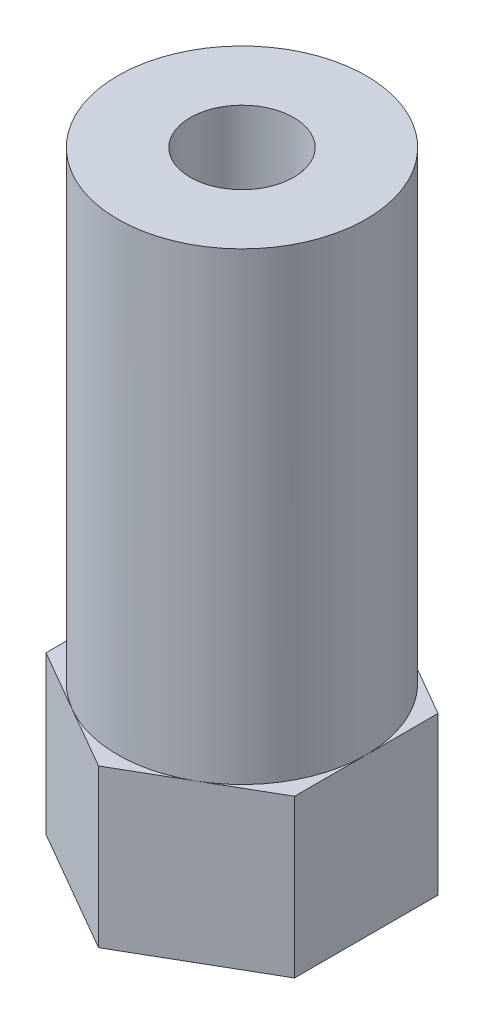
ISO-10303-21;
HEADER;
FILE_DESCRIPTION(('STEP AP214'),'2;1');
FILE_NAME('part.step','',(''),(''),'','','');
FILE_SCHEMA(('AUTOMOTIVE_DESIGN { 1 0 10303 214 1 1 1 1 }'));
ENDSEC;
DATA;
#1=APPLICATION_CONTEXT('core data for automotive mechanical design processes');
#2=APPLICATION_PROTOCOL_DEFINITION('international standard','automotive_design',2000,#1);
#3=PRODUCT_CONTEXT('',#1,'mechanical');
#4=PRODUCT('Part','Part','',(#3));
#5=PRODUCT_RELATED_PRODUCT_CATEGORY('part','',(#4));
#6=PRODUCT_DEFINITION_FORMATION('','',#4);
#7=PRODUCT_DEFINITION_CONTEXT('part definition',#1,'design');
#8=PRODUCT_DEFINITION('design','',#6,#7);
#9=PRODUCT_DEFINITION_SHAPE('','',#8);
#10=(LENGTH_UNIT() NAMED_UNIT(*) SI_UNIT(.MILLI.,.METRE.));
#11=(NAMED_UNIT(*) PLANE_ANGLE_UNIT() SI_UNIT($,.RADIAN.));
#12=(NAMED_UNIT(*) SI_UNIT($,.STERADIAN.) SOLID_ANGLE_UNIT());
#13=UNCERTAINTY_MEASURE_WITH_UNIT(LENGTH_MEASURE(1.E-05),#10,'distance_accuracy_value','');
#14=(GEOMETRIC_REPRESENTATION_CONTEXT(3) GLOBAL_UNCERTAINTY_ASSIGNED_CONTEXT((#13)) GLOBAL_UNIT_ASSIGNED_CONTEXT((#10,
#11,#12)) REPRESENTATION_CONTEXT('',''));
#15=CARTESIAN_POINT('',(0.,0.,0.));
#16=DIRECTION('',(0.,0.,1.));
#17=DIRECTION('',(1.,0.,0.));
#18=AXIS2_PLACEMENT_3D('',#15,#16,#17);
#19=CARTESIAN_POINT('',(0.,7.6,0.));
#20=DIRECTION('',(0.,1.,0.));
#21=DIRECTION('',(0.,0.,1.));
#22=AXIS2_PLACEMENT_3D('',#19,#20,#21);
#23=PLANE('',#22);
#24=CARTESIAN_POINT('',(0.,7.6,0.));
#25=DIRECTION('',(0.,1.,0.));
#26=DIRECTION('',(0.,0.,1.));
#27=AXIS2_PLACEMENT_3D('',#24,#25,#26);
#28=CIRCLE('',#27,5.99999999999998);
#29=CARTESIAN_POINT('',(2.99999999999996,7.6,5.19615242270663));
#30=VERTEX_POINT('',#29);
#31=CARTESIAN_POINT('',(6.00000000000002,7.6,0.));
#32=VERTEX_POINT('',#31);
#33=EDGE_CURVE('E49',#30,#32,#28,.T.);
#34=ORIENTED_EDGE('',*,*,#33,.F.);
#35=DIRECTION('',(0.866025403784441,0.,-0.499999999999996));
#36=VECTOR('',#35,1.);
#37=CARTESIAN_POINT('',(0.,7.6,6.92820323027551));
#38=LINE('',#37,#36);
#39=CARTESIAN_POINT('',(6.00000000000001,7.6,3.46410161513774));
#40=VERTEX_POINT('',#39);
#41=EDGE_CURVE('E124',#30,#40,#38,.T.);
#42=ORIENTED_EDGE('',*,*,#41,.T.);
#43=DIRECTION('',(0.,0.,-1.));
#44=VECTOR('',#43,1.);
#45=CARTESIAN_POINT('',(6.00000000000001,7.6,3.46410161513774));
#46=LINE('',#45,#44);
#47=EDGE_CURVE('E136',#40,#32,#46,.T.);
#48=ORIENTED_EDGE('',*,*,#47,.T.);
#49=EDGE_LOOP('',(#34,#42,#48));
#50=FACE_BOUND('',#49,.T.);
#51=ADVANCED_FACE('F33',(#50),#23,.T.);
#52=CARTESIAN_POINT('',(3.00000000000006,7.6,-5.1961524227066));
#53=VERTEX_POINT('',#52);
#54=EDGE_CURVE('E11',#32,#53,#28,.T.);
#55=ORIENTED_EDGE('',*,*,#54,.F.);
#56=CARTESIAN_POINT('',(6.00000000000004,7.6,-3.46410161513769));
#57=VERTEX_POINT('',#56);
#58=EDGE_CURVE('E123',#32,#57,#46,.T.);
#59=ORIENTED_EDGE('',*,*,#58,.T.);
#60=DIRECTION('',(-0.866025403784433,0.,-0.500000000000009));
#61=VECTOR('',#60,1.);
#62=CARTESIAN_POINT('',(6.00000000000004,7.6,-3.46410161513769));
#63=LINE('',#62,#61);
#64=EDGE_CURVE('E148',#57,#53,#63,.T.);
#65=ORIENTED_EDGE('',*,*,#64,.T.);
#66=EDGE_LOOP('',(#55,#59,#65));
#67=FACE_BOUND('',#66,.T.);
#68=ADVANCED_FACE('F207',(#67),#23,.T.);
#69=CARTESIAN_POINT('',(-2.99999999999994,7.6,-5.19615242270667));
#70=VERTEX_POINT('',#69);
#71=EDGE_CURVE('E47',#53,#70,#28,.T.);
#72=ORIENTED_EDGE('',*,*,#71,.F.);
#73=CARTESIAN_POINT('',(0.,7.6,-6.92820323027551));
#74=VERTEX_POINT('',#73);
#75=EDGE_CURVE('E147',#53,#74,#63,.T.);
#76=ORIENTED_EDGE('',*,*,#75,.T.);
#77=DIRECTION('',(-0.866025403784444,0.,0.499999999999991));
#78=VECTOR('',#77,1.);
#79=CARTESIAN_POINT('',(0.,7.6,-6.92820323027551));
#80=LINE('',#79,#78);
#81=EDGE_CURVE('E152',#74,#70,#80,.T.);
#82=ORIENTED_EDGE('',*,*,#81,.T.);
#83=EDGE_LOOP('',(#72,#76,#82));
#84=FACE_BOUND('',#83,.T.);
#85=ADVANCED_FACE('F205',(#84),#23,.T.);
#86=CARTESIAN_POINT('',(-6.,7.6,0.));
#87=VERTEX_POINT('',#86);
#88=EDGE_CURVE('E64',#70,#87,#28,.T.);
#89=ORIENTED_EDGE('',*,*,#88,.F.);
#90=CARTESIAN_POINT('',(-5.99999999999996,7.6,-3.46410161513782));
#91=VERTEX_POINT('',#90);
#92=EDGE_CURVE('E151',#70,#91,#80,.T.);
#93=ORIENTED_EDGE('',*,*,#92,.T.);
#94=DIRECTION('',(0.,0.,1.));
#95=VECTOR('',#94,1.);
#96=CARTESIAN_POINT('',(-5.99999999999996,7.6,-3.46410161513782));
#97=LINE('',#96,#95);
#98=EDGE_CURVE('E156',#91,#87,#97,.T.);
#99=ORIENTED_EDGE('',*,*,#98,.T.);
#100=EDGE_LOOP('',(#89,#93,#99));
#101=FACE_BOUND('',#100,.T.);
#102=ADVANCED_FACE('F214',(#101),#23,.T.);
#103=CARTESIAN_POINT('',(-3.00000000000006,7.6,5.1961524227066));
#104=VERTEX_POINT('',#103);
#105=EDGE_CURVE('E56',#87,#104,#28,.T.);
#106=ORIENTED_EDGE('',*,*,#105,.F.);
#107=CARTESIAN_POINT('',(-6.00000000000004,7.6,3.46410161513769));
#108=VERTEX_POINT('',#107);
#109=EDGE_CURVE('E155',#87,#108,#97,.T.);
#110=ORIENTED_EDGE('',*,*,#109,.T.);
#111=DIRECTION('',(0.866025403784433,0.,0.500000000000009));
#112=VECTOR('',#111,1.);
#113=CARTESIAN_POINT('',(-6.00000000000004,7.6,3.46410161513769));
#114=LINE('',#113,#112);
#115=EDGE_CURVE('E134',#108,#104,#114,.T.);
#116=ORIENTED_EDGE('',*,*,#115,.T.);
#117=EDGE_LOOP('',(#106,#110,#116));
#118=FACE_BOUND('',#117,.T.);
#119=ADVANCED_FACE('F219',(#118),#23,.T.);
#120=CARTESIAN_POINT('',(-6.00000000000004,7.6,3.46410161513769));
#121=DIRECTION('',(0.500000000000009,0.,-0.866025403784433));
#122=DIRECTION('',(-0.866025403784433,0.,-0.500000000000009));
#123=AXIS2_PLACEMENT_3D('',#120,#121,#122);
#124=PLANE('',#123);
#125=DIRECTION('',(0.866025403784433,0.,0.500000000000009));
#126=VECTOR('',#125,1.);
#127=CARTESIAN_POINT('',(-6.00000000000004,0.,3.46410161513769));
#128=LINE('',#127,#126);
#129=CARTESIAN_POINT('',(-6.00000000000004,0.,3.46410161513769));
#130=VERTEX_POINT('',#129);
#131=CARTESIAN_POINT('',(0.,0.,6.92820323027551));
#132=VERTEX_POINT('',#131);
#133=EDGE_CURVE('E159',#130,#132,#128,.T.);
#134=ORIENTED_EDGE('',*,*,#133,.T.);
#135=DIRECTION('',(0.,-1.,0.));
#136=VECTOR('',#135,1.);
#137=CARTESIAN_POINT('',(0.,7.6,6.92820323027551));
#138=LINE('',#137,#136);
#139=CARTESIAN_POINT('',(0.,7.6,6.92820323027551));
#140=VERTEX_POINT('',#139);
#141=EDGE_CURVE('E141',#140,#132,#138,.T.);
#142=ORIENTED_EDGE('',*,*,#141,.F.);
#143=EDGE_CURVE('E119',#104,#140,#114,.T.);
#144=ORIENTED_EDGE('',*,*,#143,.F.);
#145=ORIENTED_EDGE('',*,*,#115,.F.);
#146=DIRECTION('',(0.,-1.,0.));
#147=VECTOR('',#146,1.);
#148=CARTESIAN_POINT('',(-6.00000000000004,7.6,3.46410161513769));
#149=LINE('',#148,#147);
#150=EDGE_CURVE('E158',#108,#130,#149,.T.);
#151=ORIENTED_EDGE('',*,*,#150,.T.);
#152=EDGE_LOOP('',(#134,#142,#144,#145,#151));
#153=FACE_BOUND('',#152,.T.);
#154=ADVANCED_FACE('F35',(#153),#124,.F.);
#155=CARTESIAN_POINT('',(0.,7.6,6.92820323027551));
#156=DIRECTION('',(-0.499999999999996,0.,-0.866025403784441));
#157=DIRECTION('',(-0.866025403784441,0.,0.499999999999996));
#158=AXIS2_PLACEMENT_3D('',#155,#156,#157);
#159=PLANE('',#158);
#160=DIRECTION('',(0.866025403784441,0.,-0.499999999999996));
#161=VECTOR('',#160,1.);
#162=CARTESIAN_POINT('',(0.,0.,6.92820323027551));
#163=LINE('',#162,#161);
#164=CARTESIAN_POINT('',(6.00000000000001,0.,3.46410161513774));
#165=VERTEX_POINT('',#164);
#166=EDGE_CURVE('E162',#132,#165,#163,.T.);
#167=ORIENTED_EDGE('',*,*,#166,.T.);
#168=DIRECTION('',(0.,-1.,0.));
#169=VECTOR('',#168,1.);
#170=CARTESIAN_POINT('',(6.00000000000001,7.6,3.46410161513774));
#171=LINE('',#170,#169);
#172=EDGE_CURVE('E130',#40,#165,#171,.T.);
#173=ORIENTED_EDGE('',*,*,#172,.F.);
#174=ORIENTED_EDGE('',*,*,#41,.F.);
#175=EDGE_CURVE('E113',#140,#30,#38,.T.);
#176=ORIENTED_EDGE('',*,*,#175,.F.);
#177=ORIENTED_EDGE('',*,*,#141,.T.);
#178=EDGE_LOOP('',(#167,#173,#174,#176,#177));
#179=FACE_BOUND('',#178,.T.);
#180=ADVANCED_FACE('F128',(#179),#159,.F.);
#181=CARTESIAN_POINT('',(6.00000000000001,7.6,3.46410161513774));
#182=DIRECTION('',(-1.,0.,0.));
#183=DIRECTION('',(0.,0.,1.));
#184=AXIS2_PLACEMENT_3D('',#181,#182,#183);
#185=PLANE('',#184);
#186=DIRECTION('',(0.,0.,-1.));
#187=VECTOR('',#186,1.);
#188=CARTESIAN_POINT('',(6.00000000000001,0.,3.46410161513774));
#189=LINE('',#188,#187);
#190=CARTESIAN_POINT('',(6.00000000000004,0.,-3.46410161513769));
#191=VERTEX_POINT('',#190);
#192=EDGE_CURVE('E164',#165,#191,#189,.T.);
#193=ORIENTED_EDGE('',*,*,#192,.T.);
#194=DIRECTION('',(0.,-1.,0.));
#195=VECTOR('',#194,1.);
#196=CARTESIAN_POINT('',(6.00000000000004,7.6,-3.46410161513769));
#197=LINE('',#196,#195);
#198=EDGE_CURVE('E180',#57,#191,#197,.T.);
#199=ORIENTED_EDGE('',*,*,#198,.F.);
#200=ORIENTED_EDGE('',*,*,#58,.F.);
#201=ORIENTED_EDGE('',*,*,#47,.F.);
#202=ORIENTED_EDGE('',*,*,#172,.T.);
#203=EDGE_LOOP('',(#193,#199,#200,#201,#202));
#204=FACE_BOUND('',#203,.T.);
#205=ADVANCED_FACE('F185',(#204),#185,.F.);
#206=CARTESIAN_POINT('',(6.00000000000004,7.6,-3.46410161513769));
#207=DIRECTION('',(-0.500000000000009,0.,0.866025403784433));
#208=DIRECTION('',(0.866025403784433,0.,0.500000000000009));
#209=AXIS2_PLACEMENT_3D('',#206,#207,#208);
#210=PLANE('',#209);
#211=DIRECTION('',(-0.866025403784433,0.,-0.500000000000009));
#212=VECTOR('',#211,1.);
#213=CARTESIAN_POINT('',(6.00000000000004,0.,-3.46410161513769));
#214=LINE('',#213,#212);
#215=CARTESIAN_POINT('',(0.,0.,-6.92820323027551));
#216=VERTEX_POINT('',#215);
#217=EDGE_CURVE('E166',#191,#216,#214,.T.);
#218=ORIENTED_EDGE('',*,*,#217,.T.);
#219=DIRECTION('',(0.,-1.,0.));
#220=VECTOR('',#219,1.);
#221=CARTESIAN_POINT('',(0.,7.6,-6.92820323027551));
#222=LINE('',#221,#220);
#223=EDGE_CURVE('E177',#74,#216,#222,.T.);
#224=ORIENTED_EDGE('',*,*,#223,.F.);
#225=ORIENTED_EDGE('',*,*,#75,.F.);
#226=ORIENTED_EDGE('',*,*,#64,.F.);
#227=ORIENTED_EDGE('',*,*,#198,.T.);
#228=EDGE_LOOP('',(#218,#224,#225,#226,#227));
#229=FACE_BOUND('',#228,.T.);
#230=ADVANCED_FACE('F196',(#229),#210,.F.);
#231=CARTESIAN_POINT('',(0.,7.6,-6.92820323027551));
#232=DIRECTION('',(0.499999999999991,0.,0.866025403784444));
#233=DIRECTION('',(0.866025403784444,0.,-0.499999999999991));
#234=AXIS2_PLACEMENT_3D('',#231,#232,#233);
#235=PLANE('',#234);
#236=DIRECTION('',(-0.866025403784444,0.,0.499999999999991));
#237=VECTOR('',#236,1.);
#238=CARTESIAN_POINT('',(0.,0.,-6.92820323027551));
#239=LINE('',#238,#237);
#240=CARTESIAN_POINT('',(-5.99999999999996,0.,-3.46410161513782));
#241=VERTEX_POINT('',#240);
#242=EDGE_CURVE('E168',#216,#241,#239,.T.);
#243=ORIENTED_EDGE('',*,*,#242,.T.);
#244=DIRECTION('',(0.,-1.,0.));
#245=VECTOR('',#244,1.);
#246=CARTESIAN_POINT('',(-5.99999999999996,7.6,-3.46410161513782));
#247=LINE('',#246,#245);
#248=EDGE_CURVE('E174',#91,#241,#247,.T.);
#249=ORIENTED_EDGE('',*,*,#248,.F.);
#250=ORIENTED_EDGE('',*,*,#92,.F.);
#251=ORIENTED_EDGE('',*,*,#81,.F.);
#252=ORIENTED_EDGE('',*,*,#223,.T.);
#253=EDGE_LOOP('',(#243,#249,#250,#251,#252));
#254=FACE_BOUND('',#253,.T.);
#255=ADVANCED_FACE('F201',(#254),#235,.F.);
#256=CARTESIAN_POINT('',(-5.99999999999996,7.6,-3.46410161513782));
#257=DIRECTION('',(1.,0.,0.));
#258=DIRECTION('',(0.,0.,-1.));
#259=AXIS2_PLACEMENT_3D('',#256,#257,#258);
#260=PLANE('',#259);
#261=DIRECTION('',(0.,0.,1.));
#262=VECTOR('',#261,1.);
#263=CARTESIAN_POINT('',(-5.99999999999996,0.,-3.46410161513782));
#264=LINE('',#263,#262);
#265=EDGE_CURVE('E170',#241,#130,#264,.T.);
#266=ORIENTED_EDGE('',*,*,#265,.T.);
#267=ORIENTED_EDGE('',*,*,#150,.F.);
#268=ORIENTED_EDGE('',*,*,#109,.F.);
#269=ORIENTED_EDGE('',*,*,#98,.F.);
#270=ORIENTED_EDGE('',*,*,#248,.T.);
#271=EDGE_LOOP('',(#266,#267,#268,#269,#270));
#272=FACE_BOUND('',#271,.T.);
#273=ADVANCED_FACE('F218',(#272),#260,.F.);
#274=EDGE_CURVE('E117',#104,#30,#28,.T.);
#275=ORIENTED_EDGE('',*,*,#274,.F.);
#276=ORIENTED_EDGE('',*,*,#143,.T.);
#277=ORIENTED_EDGE('',*,*,#175,.T.);
#278=EDGE_LOOP('',(#275,#276,#277));
#279=FACE_BOUND('',#278,.T.);
#280=ADVANCED_FACE('F115',(#279),#23,.T.);
#281=CARTESIAN_POINT('',(0.,0.,0.));
#282=DIRECTION('',(0.,1.,0.));
#283=DIRECTION('',(0.,0.,1.));
#284=AXIS2_PLACEMENT_3D('',#281,#282,#283);
#285=PLANE('',#284);
#286=CARTESIAN_POINT('',(0.,0.,0.));
#287=DIRECTION('',(0.,1.,0.));
#288=DIRECTION('',(0.,0.,1.));
#289=AXIS2_PLACEMENT_3D('',#286,#287,#288);
#290=CIRCLE('',#289,2.5);
#291=CARTESIAN_POINT('',(0.,0.,2.5));
#292=VERTEX_POINT('',#291);
#293=EDGE_CURVE('E139',#292,#292,#290,.T.);
#294=ORIENTED_EDGE('',*,*,#293,.T.);
#295=EDGE_LOOP('',(#294));
#296=FACE_BOUND('',#295,.T.);
#297=ORIENTED_EDGE('',*,*,#133,.F.);
#298=ORIENTED_EDGE('',*,*,#265,.F.);
#299=ORIENTED_EDGE('',*,*,#242,.F.);
#300=ORIENTED_EDGE('',*,*,#217,.F.);
#301=ORIENTED_EDGE('',*,*,#192,.F.);
#302=ORIENTED_EDGE('',*,*,#166,.F.);
#303=EDGE_LOOP('',(#297,#298,#299,#300,#301,#302));
#304=FACE_BOUND('',#303,.T.);
#305=ADVANCED_FACE('F191',(#296,#304),#285,.F.);
#306=CARTESIAN_POINT('',(0.,30.,0.));
#307=DIRECTION('',(0.,-1.,0.));
#308=DIRECTION('',(0.,0.,-1.));
#309=AXIS2_PLACEMENT_3D('',#306,#307,#308);
#310=CYLINDRICAL_SURFACE('',#309,5.99999999999998);
#311=CARTESIAN_POINT('',(2.09201448776538,27.46,-5.62347538297977));
#312=CARTESIAN_POINT('',(2.09201693146201,27.4042497007416,-5.6234751343233));
#313=CARTESIAN_POINT('',(2.09646398959437,27.3484689575901,-5.6218262814458));
#314=CARTESIAN_POINT('',(2.11409376047993,27.2384725827119,-5.61521974757585));
#315=CARTESIAN_POINT('',(2.12728452929234,27.1842584425002,-5.61025901513725));
#316=CARTESIAN_POINT('',(2.16189361441686,27.0790030866573,-5.59701321566238));
#317=CARTESIAN_POINT('',(2.18330505447361,27.0279592605335,-5.58873092671505));
#318=CARTESIAN_POINT('',(2.233582346594,26.9304076181145,-5.56882730470198));
#319=CARTESIAN_POINT('',(2.2624473597739,26.8838992921695,-5.55720634737967));
#320=CARTESIAN_POINT('',(2.32693292822022,26.7962748601017,-5.53051607905543));
#321=CARTESIAN_POINT('',(2.36261083806936,26.7552099474454,-5.51541724919479));
#322=CARTESIAN_POINT('',(2.43937429545879,26.6800826772554,-5.48189782216839));
#323=CARTESIAN_POINT('',(2.48046016326602,26.6460207347539,-5.46347702824728));
#324=CARTESIAN_POINT('',(2.56698353929338,26.5856741731123,-5.42336420820773));
#325=CARTESIAN_POINT('',(2.61244556167514,26.5594371969073,-5.40165330999448));
#326=CARTESIAN_POINT('',(2.70606794166505,26.5157915717878,-5.35536366107626));
#327=CARTESIAN_POINT('',(2.75422812359837,26.4983823488461,-5.33078509696998));
#328=CARTESIAN_POINT('',(2.85129295237778,26.4730429860064,-5.27949924185673));
#329=CARTESIAN_POINT('',(2.90018662424429,26.4650268335981,-5.25281369396614));
#330=CARTESIAN_POINT('',(2.99767920788383,26.458433698339,-5.1977929212682));
#331=CARTESIAN_POINT('',(3.04627813946715,26.4598560739011,-5.16945780872032));
#332=CARTESIAN_POINT('',(3.14130776814618,26.4720325406113,-5.11226290857682));
#333=CARTESIAN_POINT('',(3.18775517312189,26.4826940653637,-5.08341109737747));
#334=CARTESIAN_POINT('',(3.2777576532119,26.5129004296986,-5.02584920657126));
#335=CARTESIAN_POINT('',(3.32131264018966,26.5324455398358,-4.99713913130796));
#336=CARTESIAN_POINT('',(3.4046489132438,26.5799562561261,-4.94073998144625));
#337=CARTESIAN_POINT('',(3.44441200889309,26.607960004833,-4.91305618318792));
#338=CARTESIAN_POINT('',(3.51903146572504,26.671565129054,-4.85988886819197));
#339=CARTESIAN_POINT('',(3.55388742940056,26.7071671194843,-4.83440552976936));
#340=CARTESIAN_POINT('',(3.61833579425722,26.7854715226477,-4.78636441574121));
#341=CARTESIAN_POINT('',(3.64785920726528,26.8282548379604,-4.76384588403876));
#342=CARTESIAN_POINT('',(3.70049280901762,26.9194348360863,-4.72307788750329));
#343=CARTESIAN_POINT('',(3.72360293860442,26.9678315706731,-4.70482846204965));
#344=CARTESIAN_POINT('',(3.76294760600346,27.068956656751,-4.67342089222699));
#345=CARTESIAN_POINT('',(3.77917441368343,27.1216897992368,-4.66026847334058));
#346=CARTESIAN_POINT('',(3.8043642885429,27.229939628923,-4.63972834160438));
#347=CARTESIAN_POINT('',(3.8133279953001,27.285456070573,-4.63234012117012));
#348=CARTESIAN_POINT('',(3.82373331669719,27.3969864624649,-4.62375487120993));
#349=CARTESIAN_POINT('',(3.82526349106369,27.4529865518808,-4.6224849525306));
#350=CARTESIAN_POINT('',(3.82100851820623,27.5645146686763,-4.62600272754065));
#351=CARTESIAN_POINT('',(3.81522365353291,27.6200427142056,-4.63079018725778));
#352=CARTESIAN_POINT('',(3.79652481383217,27.7286911036763,-4.64613200181076));
#353=CARTESIAN_POINT('',(3.78365616631076,27.7818244559512,-4.65664968590434));
#354=CARTESIAN_POINT('',(3.75109084234002,27.8845880665118,-4.68292137058537));
#355=CARTESIAN_POINT('',(3.73139375742191,27.9342181150204,-4.69867568441929));
#356=CARTESIAN_POINT('',(3.68536138576027,28.0290698377624,-4.7348678258058));
#357=CARTESIAN_POINT('',(3.65896654715865,28.0742466291024,-4.7553475115461));
#358=CARTESIAN_POINT('',(3.60017336002657,28.158445413078,-4.80001160305553));
#359=CARTESIAN_POINT('',(3.56777458922525,28.1974669724439,-4.82419626938402));
#360=CARTESIAN_POINT('',(3.49728894070413,28.2686607570915,-4.87553967778519));
#361=CARTESIAN_POINT('',(3.45914641209303,28.3007575305138,-4.90272673385571));
#362=CARTESIAN_POINT('',(3.37829509287796,28.356662130802,-4.95878398546573));
#363=CARTESIAN_POINT('',(3.33558645003686,28.3804702257895,-4.98765412652559));
#364=CARTESIAN_POINT('',(3.246848447431,28.4190042335819,-5.0458672342255));
#365=CARTESIAN_POINT('',(3.20083451867359,28.433769630294,-5.07520756288079));
#366=CARTESIAN_POINT('',(3.10654255311907,28.4539262395855,-5.13346494997755));
#367=CARTESIAN_POINT('',(3.05826470295337,28.4593182234929,-5.16238204305242));
#368=CARTESIAN_POINT('',(2.96140704441945,28.4605527529249,-5.21854048344576));
#369=CARTESIAN_POINT('',(2.91283796503161,28.4565101015764,-5.24579787813237));
#370=CARTESIAN_POINT('',(2.81624166887481,28.4392384310922,-5.29828323633543));
#371=CARTESIAN_POINT('',(2.76821444907319,28.4260094633962,-5.32351121121493));
#372=CARTESIAN_POINT('',(2.67419365552177,28.3907847337825,-5.37135643737686));
#373=CARTESIAN_POINT('',(2.62819788066151,28.3687987327158,-5.39397655937374));
#374=CARTESIAN_POINT('',(2.53957830555703,28.3166968255079,-5.43626301740996));
#375=CARTESIAN_POINT('',(2.49695466528221,28.2865805339756,-5.45592921335884));
#376=CARTESIAN_POINT('',(2.41593408374924,28.2186659630152,-5.49229093721271));
#377=CARTESIAN_POINT('',(2.37759116722539,28.1807836180972,-5.5089498457458));
#378=CARTESIAN_POINT('',(2.30693991878812,28.0985886768407,-5.53890825010822));
#379=CARTESIAN_POINT('',(2.27463300243959,28.0542745764434,-5.55220695815921));
#380=CARTESIAN_POINT('',(2.21695489814451,27.9601018709969,-5.57548993841061));
#381=CARTESIAN_POINT('',(2.19163438661865,27.9102062640648,-5.58545010051414));
#382=CARTESIAN_POINT('',(2.1491719924284,27.8065563056354,-5.6019267142427));
#383=CARTESIAN_POINT('',(2.13202193973664,27.7528058709212,-5.60844660666065));
#384=CARTESIAN_POINT('',(2.11024274857755,27.6590384922093,-5.61666849933777));
#385=CARTESIAN_POINT('',(2.10342050654989,27.6195892768166,-5.61922112116285));
#386=CARTESIAN_POINT('',(2.09430553934738,27.5400986060636,-5.6226246368685));
#387=CARTESIAN_POINT('',(2.09201273194431,27.5000571614679,-5.623475561642));
#388=CARTESIAN_POINT('',(2.09201448776538,27.46,-5.62347538297977));
#389=B_SPLINE_CURVE_WITH_KNOTS('',3,(#311,#312,#313,#314,#315,#316,#317,#318,#319,#320,#321,
#322,#323,#324,#325,#326,#327,#328,#329,#330,#331,#332,#333,#334,#335,#336,#337,#338,#339,#340,
#341,#342,#343,#344,#345,#346,#347,#348,#349,#350,#351,#352,#353,#354,#355,#356,#357,#358,#359,
#360,#361,#362,#363,#364,#365,#366,#367,#368,#369,#370,#371,#372,#373,#374,#375,#376,#377,#378,
#379,#380,#381,#382,#383,#384,#385,#386,#387,#388),.UNSPECIFIED.,.T.,.F.,(4,2,2,2,2,2,2,2,2,2,2,
2,2,2,2,2,2,2,2,2,2,2,2,2,2,2,2,2,2,2,2,2,2,2,2,2,2,2,4),(0.,0.167104415562128,
0.334363007967779,0.501481999132666,0.668582189603683,0.837156636605447,1.00574107132038,
1.17533192042833,1.34491174042704,1.51292626987285,1.68092937859336,1.84726848464127,
2.01361265698073,2.1807184165403,2.34783770488965,2.51698449383109,2.68613284296667,
2.85547064997701,3.02479354373491,3.19209416966424,3.3593883336385,3.52562425852456,
3.69187012915689,3.8596493710334,4.02744041770535,4.19697645212412,4.36650700188939,
4.53529193765318,4.704062983632,4.87079110504626,5.03751829285789,5.20406015931243,
5.37060992155194,5.53906798983561,5.70756551550984,5.87725491045141,6.04677426695052,
6.16684268214776,6.28690891757998),.UNSPECIFIED.);
#390=CARTESIAN_POINT('',(2.09201448776538,27.46,-5.62347538297977));
#391=VERTEX_POINT('',#390);
#392=EDGE_CURVE('E343',#391,#391,#389,.T.);
#393=ORIENTED_EDGE('',*,*,#392,.T.);
#394=EDGE_LOOP('',(#393));
#395=FACE_BOUND('',#394,.T.);
#396=CARTESIAN_POINT('',(0.,30.,0.));
#397=DIRECTION('',(0.,1.,0.));
#398=DIRECTION('',(0.,0.,1.));
#399=AXIS2_PLACEMENT_3D('',#396,#397,#398);
#400=CIRCLE('',#399,5.99999999999998);
#401=CARTESIAN_POINT('',(0.,30.,5.99999999999998));
#402=VERTEX_POINT('',#401);
#403=EDGE_CURVE('E138',#402,#402,#400,.T.);
#404=ORIENTED_EDGE('',*,*,#403,.F.);
#405=EDGE_LOOP('',(#404));
#406=FACE_BOUND('',#405,.T.);
#407=ORIENTED_EDGE('',*,*,#33,.T.);
#408=ORIENTED_EDGE('',*,*,#54,.T.);
#409=ORIENTED_EDGE('',*,*,#71,.T.);
#410=ORIENTED_EDGE('',*,*,#88,.T.);
#411=ORIENTED_EDGE('',*,*,#105,.T.);
#412=ORIENTED_EDGE('',*,*,#274,.T.);
#413=EDGE_LOOP('',(#407,#408,#409,#410,#411,#412));
#414=FACE_BOUND('',#413,.T.);
#415=ADVANCED_FACE('F140',(#395,#406,#414),#310,.T.);
#416=CARTESIAN_POINT('',(0.,30.,0.));
#417=DIRECTION('',(0.,1.,0.));
#418=DIRECTION('',(0.,0.,1.));
#419=AXIS2_PLACEMENT_3D('',#416,#417,#418);
#420=PLANE('',#419);
#421=CARTESIAN_POINT('',(0.,30.,0.));
#422=DIRECTION('',(0.,1.,0.));
#423=DIRECTION('',(0.,0.,1.));
#424=AXIS2_PLACEMENT_3D('',#421,#422,#423);
#425=CIRCLE('',#424,2.5);
#426=CARTESIAN_POINT('',(0.,30.,2.5));
#427=VERTEX_POINT('',#426);
#428=EDGE_CURVE('E349',#427,#427,#425,.T.);
#429=ORIENTED_EDGE('',*,*,#428,.F.);
#430=EDGE_LOOP('',(#429));
#431=FACE_BOUND('',#430,.T.);
#432=ORIENTED_EDGE('',*,*,#403,.T.);
#433=EDGE_LOOP('',(#432));
#434=FACE_BOUND('',#433,.T.);
#435=ADVANCED_FACE('F303',(#431,#434),#420,.T.);
#436=CARTESIAN_POINT('',(0.,0.,0.));
#437=DIRECTION('',(0.,1.,0.));
#438=DIRECTION('',(0.,0.,1.));
#439=AXIS2_PLACEMENT_3D('',#436,#437,#438);
#440=CYLINDRICAL_SURFACE('',#439,2.5);
#441=CARTESIAN_POINT('',(0.279618519954492,27.46,-2.48431348329845));
#442=CARTESIAN_POINT('',(0.27962631143554,27.5135697490499,-2.48431523274327));
#443=CARTESIAN_POINT('',(0.284321070975532,27.5672152673523,-2.48379835918642));
#444=CARTESIAN_POINT('',(0.302841536743038,27.6729674164385,-2.48160595887396));
#445=CARTESIAN_POINT('',(0.316690575167052,27.7250697585402,-2.47992747090973));
#446=CARTESIAN_POINT('',(0.352663691063509,27.826026470985,-2.47506646347553));
#447=CARTESIAN_POINT('',(0.374756585939789,27.8748922736801,-2.47188959984425));
#448=CARTESIAN_POINT('',(0.426157769997968,27.9684425254298,-2.4635471790484));
#449=CARTESIAN_POINT('',(0.455464483648648,28.0131278845754,-2.45838205599014));
#450=CARTESIAN_POINT('',(0.521840169925602,28.0996302011207,-2.445175662329));
#451=CARTESIAN_POINT('',(0.559232881804563,28.1411782114647,-2.43699912227605));
#452=CARTESIAN_POINT('',(0.639410463862936,28.2177644986577,-2.41720051607589));
#453=CARTESIAN_POINT('',(0.682197209631123,28.2528005006449,-2.40557724953856));
#454=CARTESIAN_POINT('',(0.773538602738519,28.3167031984913,-2.37781447191539));
#455=CARTESIAN_POINT('',(0.82225416124728,28.3452721507353,-2.36151494962756));
#456=CARTESIAN_POINT('',(0.922285222217,28.3934217841949,-2.32427018682497));
#457=CARTESIAN_POINT('',(0.973599657257296,28.413006122891,-2.3033268418893));
#458=CARTESIAN_POINT('',(1.07445430747468,28.4416707432187,-2.25797587779632));
#459=CARTESIAN_POINT('',(1.12396014570675,28.4512136570445,-2.23378506285126));
#460=CARTESIAN_POINT('',(1.22193962740076,28.4610142428313,-2.1817278470776));
#461=CARTESIAN_POINT('',(1.27041364910246,28.4612753779674,-2.1538628210491));
#462=CARTESIAN_POINT('',(1.36210490811506,28.4527586151125,-2.09700241137895));
#463=CARTESIAN_POINT('',(1.40546448017057,28.4444876136265,-2.06815843501482));
#464=CARTESIAN_POINT('',(1.48879892088993,28.4200035618446,-2.00900226401679));
#465=CARTESIAN_POINT('',(1.52877354094827,28.4037899287998,-1.97868996179927));
#466=CARTESIAN_POINT('',(1.60513782895639,28.3636817585618,-1.91728233439166));
#467=CARTESIAN_POINT('',(1.64146438675488,28.3396751425922,-1.88618209329475));
#468=CARTESIAN_POINT('',(1.70935581913261,28.2847674965405,-1.82488297621067));
#469=CARTESIAN_POINT('',(1.74091905545173,28.2538641034512,-1.79468441319116));
#470=CARTESIAN_POINT('',(1.80092658465082,28.1836754320267,-1.73452751732461));
#471=CARTESIAN_POINT('',(1.82903004944751,28.1439730537081,-1.70471512893971));
#472=CARTESIAN_POINT('',(1.87936906387706,28.0585047140895,-1.64905528942295));
#473=CARTESIAN_POINT('',(1.90160269333413,28.0127367759229,-1.62320913690493));
#474=CARTESIAN_POINT('',(1.94062842899083,27.9147904887955,-1.57636284888181));
#475=CARTESIAN_POINT('',(1.95724909171607,27.8624675847581,-1.55552021818541));
#476=CARTESIAN_POINT('',(1.98401462309612,27.753892254769,-1.52123787019588));
#477=CARTESIAN_POINT('',(1.9941636980337,27.6976424076146,-1.50779334519947));
#478=CARTESIAN_POINT('',(2.00745113011324,27.586482111282,-1.49005240223578));
#479=CARTESIAN_POINT('',(2.01097991079426,27.5316997764399,-1.48524728168762));
#480=CARTESIAN_POINT('',(2.01217522266139,27.421961396116,-1.48362839293178));
#481=CARTESIAN_POINT('',(2.00984353157075,27.3670054083611,-1.48681220135137));
#482=CARTESIAN_POINT('',(1.9996582885685,27.2617705325226,-1.50047685878839));
#483=CARTESIAN_POINT('',(1.99212680117123,27.2114035313002,-1.51053177272483));
#484=CARTESIAN_POINT('',(1.97197120487053,27.113355797607,-1.53675013098734));
#485=CARTESIAN_POINT('',(1.95934596676022,27.0656756634463,-1.55291492973151));
#486=CARTESIAN_POINT('',(1.9284824038777,26.9721988211023,-1.59109386553733));
#487=CARTESIAN_POINT('',(1.91003721279206,26.9265569056528,-1.61331862863855));
#488=CARTESIAN_POINT('',(1.86782648725303,26.8402585062792,-1.66200515120333));
#489=CARTESIAN_POINT('',(1.84405878559953,26.7996040636022,-1.68846863532022));
#490=CARTESIAN_POINT('',(1.78935101726749,26.7213132957004,-1.74640266280192));
#491=CARTESIAN_POINT('',(1.75801084075086,26.6841217173545,-1.77809866699231));
#492=CARTESIAN_POINT('',(1.68953845687917,26.6174114616948,-1.84328281528745));
#493=CARTESIAN_POINT('',(1.65240601386179,26.5878930967014,-1.87677103227317));
#494=CARTESIAN_POINT('',(1.57283041220508,26.5374761867694,-1.94394225162699));
#495=CARTESIAN_POINT('',(1.53038852833033,26.5165755779171,-1.97762520539468));
#496=CARTESIAN_POINT('',(1.44107395479586,26.4842255737962,-2.04361971625147));
#497=CARTESIAN_POINT('',(1.39420368519258,26.47277104928,-2.07593200855909));
#498=CARTESIAN_POINT('',(1.30053055329693,26.4602476491873,-2.1357684847597));
#499=CARTESIAN_POINT('',(1.25392280673009,26.4585499357687,-2.16346751743287));
#500=CARTESIAN_POINT('',(1.15939362027174,26.463927739642,-2.21556249201516));
#501=CARTESIAN_POINT('',(1.11147238031346,26.4710019288928,-2.23995893330709));
#502=CARTESIAN_POINT('',(1.01732215030931,26.4932733941792,-2.28422455394739));
#503=CARTESIAN_POINT('',(0.971086395562825,26.5082144730378,-2.30420978030217));
#504=CARTESIAN_POINT('',(0.880182626211642,26.5455264022809,-2.34044338329695));
#505=CARTESIAN_POINT('',(0.83551490244177,26.5678986230102,-2.35669106977742));
#506=CARTESIAN_POINT('',(0.747107445731105,26.6205515992447,-2.38623109657544));
#507=CARTESIAN_POINT('',(0.703495947544992,26.6511381474425,-2.39936111087321));
#508=CARTESIAN_POINT('',(0.620682003480086,26.7188942595895,-2.42210679389527));
#509=CARTESIAN_POINT('',(0.581481393518515,26.7560665482301,-2.43172100297582));
#510=CARTESIAN_POINT('',(0.506494303887172,26.8386576122625,-2.44847513316285));
#511=CARTESIAN_POINT('',(0.471069408491076,26.8844444367005,-2.45542503659704));
#512=CARTESIAN_POINT('',(0.408087879255026,26.9814710687144,-2.46667639126219));
#513=CARTESIAN_POINT('',(0.380532170528179,27.0327115164549,-2.47097753116931));
#514=CARTESIAN_POINT('',(0.336774962911538,27.134518600924,-2.47730243415327));
#515=CARTESIAN_POINT('',(0.319776123782852,27.1847326173756,-2.47949600760359));
#516=CARTESIAN_POINT('',(0.294403162626181,27.2872427098152,-2.48263899339595));
#517=CARTESIAN_POINT('',(0.286005008871075,27.3395325579835,-2.48359187447196));
#518=CARTESIAN_POINT('',(0.28045073876814,27.414688781169,-2.48421918687687));
#519=CARTESIAN_POINT('',(0.279615223811027,27.4373376104988,-2.48431274320538));
#520=CARTESIAN_POINT('',(0.279618519954492,27.46,-2.48431348329845));
#521=B_SPLINE_CURVE_WITH_KNOTS('',3,(#441,#442,#443,#444,#445,#446,#447,#448,#449,#450,#451,
#452,#453,#454,#455,#456,#457,#458,#459,#460,#461,#462,#463,#464,#465,#466,#467,#468,#469,#470,
#471,#472,#473,#474,#475,#476,#477,#478,#479,#480,#481,#482,#483,#484,#485,#486,#487,#488,#489,
#490,#491,#492,#493,#494,#495,#496,#497,#498,#499,#500,#501,#502,#503,#504,#505,#506,#507,#508,
#509,#510,#511,#512,#513,#514,#515,#516,#517,#518,#519,#520),.UNSPECIFIED.,.T.,.F.,(4,2,2,2,2,2,
2,2,2,2,2,2,2,2,2,2,2,2,2,2,2,2,2,2,2,2,2,2,2,2,2,2,2,2,2,2,2,2,2,4),(0.,0.160638824383824,
0.321688667911121,0.482135411646689,0.642547144119302,0.811278091422118,0.980067871741707,
1.15551334545714,1.3308873348474,1.49777091443592,1.66459222652836,1.82204322415152,
1.9795057756453,2.1393415011745,2.29923207470016,2.46962022040678,2.64006403563563,
2.81532229357288,2.99046652397055,3.15491073759215,3.31930507450975,3.47433624039578,
3.62940179322824,3.79075577323356,3.9521755725993,4.12551867120495,4.2988688242338,
4.47217743653412,4.64539187974073,4.80730519874982,4.96919400753306,5.12610997218681,
5.28305488911298,5.44693525566968,5.61088358279109,5.78498126639812,5.959099408766,
6.11758330406544,6.27562315106628,6.34358052760368),.UNSPECIFIED.);
#522=CARTESIAN_POINT('',(0.279618519954492,27.46,-2.48431348329845));
#523=VERTEX_POINT('',#522);
#524=EDGE_CURVE('E37',#523,#523,#521,.T.);
#525=ORIENTED_EDGE('',*,*,#524,.T.);
#526=EDGE_LOOP('',(#525));
#527=FACE_BOUND('',#526,.T.);
#528=ORIENTED_EDGE('',*,*,#293,.F.);
#529=EDGE_LOOP('',(#528));
#530=FACE_BOUND('',#529,.T.);
#531=ORIENTED_EDGE('',*,*,#428,.T.);
#532=EDGE_LOOP('',(#531));
#533=FACE_BOUND('',#532,.T.);
#534=ADVANCED_FACE('F308',(#527,#530,#533),#440,.F.);
#535=CARTESIAN_POINT('',(0.299999999999956,27.46,-0.519615242270685));
#536=DIRECTION('',(0.500000000000012,0.,-0.866025403784431));
#537=DIRECTION('',(-0.866025403784432,0.,-0.500000000000012));
#538=AXIS2_PLACEMENT_3D('',#535,#536,#537);
#539=CYLINDRICAL_SURFACE('',#538,1.);
#540=ORIENTED_EDGE('',*,*,#524,.F.);
#541=EDGE_LOOP('',(#540));
#542=FACE_BOUND('',#541,.T.);
#543=ORIENTED_EDGE('',*,*,#392,.F.);
#544=EDGE_LOOP('',(#543));
#545=FACE_BOUND('',#544,.T.);
#546=ADVANCED_FACE('F325',(#542,#545),#539,.F.);
#547=CLOSED_SHELL('',(#51,#68,#85,#102,#119,#154,#180,#205,#230,#255,#273,#280,#305,#415,#435,
#534,#546));
#548=MANIFOLD_SOLID_BREP('B2',#547);
#549=ADVANCED_BREP_SHAPE_REPRESENTATION('',(#18,#548),#14);
#550=SHAPE_DEFINITION_REPRESENTATION(#9,#549);
ENDSEC;
END-ISO-10303-21;
